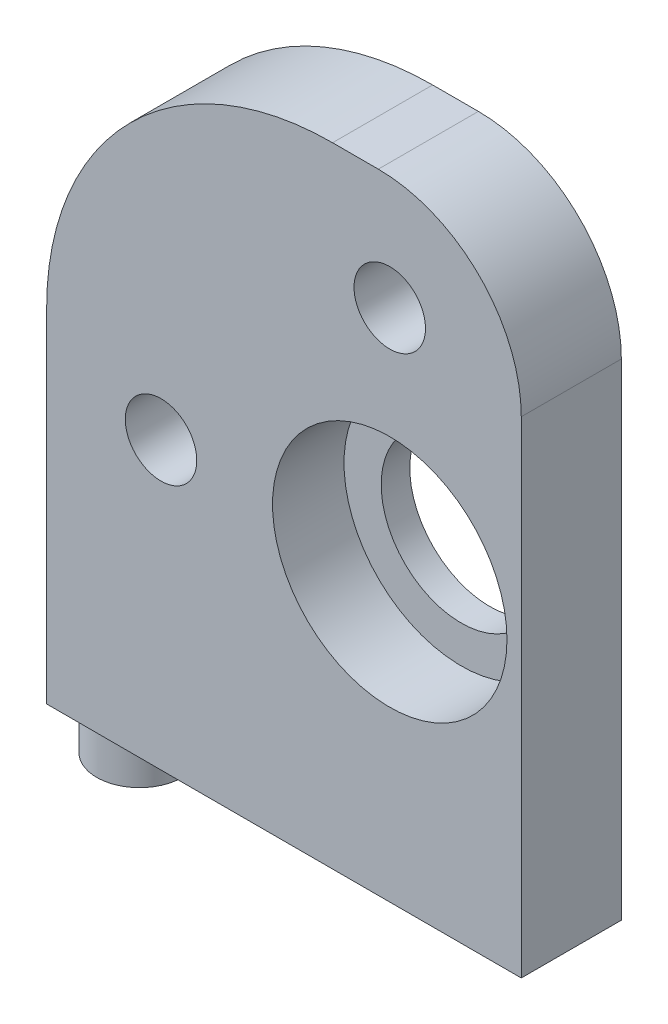
ISO-10303-21;
HEADER;
FILE_DESCRIPTION(('STEP AP214'),'2;1');
FILE_NAME('part.step','',(''),(''),'','','');
FILE_SCHEMA(('AUTOMOTIVE_DESIGN { 1 0 10303 214 1 1 1 1 }'));
ENDSEC;
DATA;
#1=APPLICATION_CONTEXT('core data for automotive mechanical design processes');
#2=APPLICATION_PROTOCOL_DEFINITION('international standard','automotive_design',2000,#1);
#3=PRODUCT_CONTEXT('',#1,'mechanical');
#4=PRODUCT('Part','Part','',(#3));
#5=PRODUCT_RELATED_PRODUCT_CATEGORY('part','',(#4));
#6=PRODUCT_DEFINITION_FORMATION('','',#4);
#7=PRODUCT_DEFINITION_CONTEXT('part definition',#1,'design');
#8=PRODUCT_DEFINITION('design','',#6,#7);
#9=PRODUCT_DEFINITION_SHAPE('','',#8);
#10=(LENGTH_UNIT() NAMED_UNIT(*) SI_UNIT(.MILLI.,.METRE.));
#11=(NAMED_UNIT(*) PLANE_ANGLE_UNIT() SI_UNIT($,.RADIAN.));
#12=(NAMED_UNIT(*) SI_UNIT($,.STERADIAN.) SOLID_ANGLE_UNIT());
#13=UNCERTAINTY_MEASURE_WITH_UNIT(LENGTH_MEASURE(1.E-05),#10,'distance_accuracy_value','');
#14=(GEOMETRIC_REPRESENTATION_CONTEXT(3) GLOBAL_UNCERTAINTY_ASSIGNED_CONTEXT((#13)) GLOBAL_UNIT_ASSIGNED_CONTEXT((#10,
#11,#12)) REPRESENTATION_CONTEXT('',''));
#15=CARTESIAN_POINT('',(0.,0.,0.));
#16=DIRECTION('',(0.,0.,1.));
#17=DIRECTION('',(1.,0.,0.));
#18=AXIS2_PLACEMENT_3D('',#15,#16,#17);
#19=CARTESIAN_POINT('',(4.6,0.,3.5));
#20=DIRECTION('',(1.,0.,0.));
#21=DIRECTION('',(0.,1.,0.));
#22=AXIS2_PLACEMENT_3D('',#19,#20,#21);
#23=PLANE('',#22);
#24=DIRECTION('',(0.,-1.,0.));
#25=VECTOR('',#24,1.);
#26=CARTESIAN_POINT('',(4.6,0.,0.));
#27=LINE('',#26,#25);
#28=CARTESIAN_POINT('',(4.6,7.,0.));
#29=VERTEX_POINT('',#28);
#30=CARTESIAN_POINT('',(4.6,-10.,0.));
#31=VERTEX_POINT('',#30);
#32=EDGE_CURVE('E164',#29,#31,#27,.T.);
#33=ORIENTED_EDGE('',*,*,#32,.F.);
#34=DIRECTION('',(0.,0.,-1.));
#35=VECTOR('',#34,1.);
#36=CARTESIAN_POINT('',(4.6,7.,3.5));
#37=LINE('',#36,#35);
#38=CARTESIAN_POINT('',(4.6,7.,3.5));
#39=VERTEX_POINT('',#38);
#40=EDGE_CURVE('E54',#29,#39,#37,.F.);
#41=ORIENTED_EDGE('',*,*,#40,.T.);
#42=DIRECTION('',(0.,-1.,0.));
#43=VECTOR('',#42,1.);
#44=CARTESIAN_POINT('',(4.6,0.,3.5));
#45=LINE('',#44,#43);
#46=CARTESIAN_POINT('',(4.6,-10.,3.5));
#47=VERTEX_POINT('',#46);
#48=EDGE_CURVE('E192',#39,#47,#45,.T.);
#49=ORIENTED_EDGE('',*,*,#48,.T.);
#50=DIRECTION('',(0.,0.,-1.));
#51=VECTOR('',#50,1.);
#52=CARTESIAN_POINT('',(4.6,-10.,3.5));
#53=LINE('',#52,#51);
#54=EDGE_CURVE('E123',#47,#31,#53,.T.);
#55=ORIENTED_EDGE('',*,*,#54,.T.);
#56=EDGE_LOOP('',(#33,#41,#49,#55));
#57=FACE_BOUND('',#56,.T.);
#58=ADVANCED_FACE('F45',(#57),#23,.T.);
#59=CARTESIAN_POINT('',(0.,12.,3.5));
#60=DIRECTION('',(0.,1.,0.));
#61=DIRECTION('',(0.,0.,1.));
#62=AXIS2_PLACEMENT_3D('',#59,#60,#61);
#63=PLANE('',#62);
#64=DIRECTION('',(1.,0.,0.));
#65=VECTOR('',#64,1.);
#66=CARTESIAN_POINT('',(0.,12.,3.5));
#67=LINE('',#66,#65);
#68=CARTESIAN_POINT('',(-2.,12.,3.5));
#69=VERTEX_POINT('',#68);
#70=CARTESIAN_POINT('',(-0.400000000000001,12.,3.5));
#71=VERTEX_POINT('',#70);
#72=EDGE_CURVE('E158',#69,#71,#67,.T.);
#73=ORIENTED_EDGE('',*,*,#72,.T.);
#74=DIRECTION('',(0.,0.,-1.));
#75=VECTOR('',#74,1.);
#76=CARTESIAN_POINT('',(-0.400000000000001,12.,3.5));
#77=LINE('',#76,#75);
#78=CARTESIAN_POINT('',(-0.400000000000001,12.,0.));
#79=VERTEX_POINT('',#78);
#80=EDGE_CURVE('E144',#71,#79,#77,.T.);
#81=ORIENTED_EDGE('',*,*,#80,.T.);
#82=DIRECTION('',(1.,0.,0.));
#83=VECTOR('',#82,1.);
#84=CARTESIAN_POINT('',(0.,12.,0.));
#85=LINE('',#84,#83);
#86=CARTESIAN_POINT('',(-2.,12.,0.));
#87=VERTEX_POINT('',#86);
#88=EDGE_CURVE('E155',#87,#79,#85,.T.);
#89=ORIENTED_EDGE('',*,*,#88,.F.);
#90=DIRECTION('',(0.,0.,-1.));
#91=VECTOR('',#90,1.);
#92=CARTESIAN_POINT('',(-2.,12.,3.5));
#93=LINE('',#92,#91);
#94=EDGE_CURVE('E138',#87,#69,#93,.F.);
#95=ORIENTED_EDGE('',*,*,#94,.T.);
#96=EDGE_LOOP('',(#73,#81,#89,#95));
#97=FACE_BOUND('',#96,.T.);
#98=ADVANCED_FACE('F154',(#97),#63,.T.);
#99=CARTESIAN_POINT('',(-12.,0.,3.5));
#100=DIRECTION('',(1.,0.,0.));
#101=DIRECTION('',(0.,1.,0.));
#102=AXIS2_PLACEMENT_3D('',#99,#100,#101);
#103=PLANE('',#102);
#104=DIRECTION('',(0.,-1.,0.));
#105=VECTOR('',#104,1.);
#106=CARTESIAN_POINT('',(-12.,0.,3.5));
#107=LINE('',#106,#105);
#108=CARTESIAN_POINT('',(-12.,2.,3.5));
#109=VERTEX_POINT('',#108);
#110=CARTESIAN_POINT('',(-12.,-10.,3.5));
#111=VERTEX_POINT('',#110);
#112=EDGE_CURVE('E197',#109,#111,#107,.T.);
#113=ORIENTED_EDGE('',*,*,#112,.F.);
#114=DIRECTION('',(0.,0.,-1.));
#115=VECTOR('',#114,1.);
#116=CARTESIAN_POINT('',(-12.,2.,0.));
#117=LINE('',#116,#115);
#118=CARTESIAN_POINT('',(-12.,2.,0.));
#119=VERTEX_POINT('',#118);
#120=EDGE_CURVE('E132',#109,#119,#117,.T.);
#121=ORIENTED_EDGE('',*,*,#120,.T.);
#122=DIRECTION('',(0.,-1.,0.));
#123=VECTOR('',#122,1.);
#124=CARTESIAN_POINT('',(-12.,0.,0.));
#125=LINE('',#124,#123);
#126=CARTESIAN_POINT('',(-12.,-10.,0.));
#127=VERTEX_POINT('',#126);
#128=EDGE_CURVE('E119',#119,#127,#125,.T.);
#129=ORIENTED_EDGE('',*,*,#128,.T.);
#130=DIRECTION('',(0.,0.,-1.));
#131=VECTOR('',#130,1.);
#132=CARTESIAN_POINT('',(-12.,-10.,3.5));
#133=LINE('',#132,#131);
#134=CARTESIAN_POINT('',(-12.,-10.,1.75));
#135=VERTEX_POINT('',#134);
#136=EDGE_CURVE('E113',#135,#127,#133,.T.);
#137=ORIENTED_EDGE('',*,*,#136,.F.);
#138=EDGE_CURVE('E101',#111,#135,#133,.T.);
#139=ORIENTED_EDGE('',*,*,#138,.F.);
#140=EDGE_LOOP('',(#113,#121,#129,#137,#139));
#141=FACE_BOUND('',#140,.T.);
#142=ADVANCED_FACE('F116',(#141),#103,.F.);
#143=CARTESIAN_POINT('',(0.,0.,3.5));
#144=DIRECTION('',(0.,0.,-1.));
#145=DIRECTION('',(-1.,0.,0.));
#146=AXIS2_PLACEMENT_3D('',#143,#144,#145);
#147=CYLINDRICAL_SURFACE('',#146,4.1);
#148=CARTESIAN_POINT('',(0.,0.,1.));
#149=DIRECTION('',(0.,0.,1.));
#150=DIRECTION('',(1.,0.,0.));
#151=AXIS2_PLACEMENT_3D('',#148,#149,#150);
#152=CIRCLE('',#151,4.1);
#153=CARTESIAN_POINT('',(4.1,0.,1.));
#154=VERTEX_POINT('',#153);
#155=EDGE_CURVE('E112',#154,#154,#152,.T.);
#156=ORIENTED_EDGE('',*,*,#155,.F.);
#157=EDGE_LOOP('',(#156));
#158=FACE_BOUND('',#157,.T.);
#159=CARTESIAN_POINT('',(0.,0.,3.5));
#160=DIRECTION('',(0.,0.,1.));
#161=DIRECTION('',(1.,0.,0.));
#162=AXIS2_PLACEMENT_3D('',#159,#160,#161);
#163=CIRCLE('',#162,4.1);
#164=CARTESIAN_POINT('',(4.1,0.,3.5));
#165=VERTEX_POINT('',#164);
#166=EDGE_CURVE('E183',#165,#165,#163,.T.);
#167=ORIENTED_EDGE('',*,*,#166,.T.);
#168=EDGE_LOOP('',(#167));
#169=FACE_BOUND('',#168,.T.);
#170=ADVANCED_FACE('F214',(#158,#169),#147,.F.);
#171=CARTESIAN_POINT('',(0.,8.,3.5));
#172=DIRECTION('',(0.,0.,-1.));
#173=DIRECTION('',(-1.,0.,0.));
#174=AXIS2_PLACEMENT_3D('',#171,#172,#173);
#175=CYLINDRICAL_SURFACE('',#174,1.25);
#176=CARTESIAN_POINT('',(0.,8.,3.5));
#177=DIRECTION('',(0.,0.,1.));
#178=DIRECTION('',(1.,0.,0.));
#179=AXIS2_PLACEMENT_3D('',#176,#177,#178);
#180=CIRCLE('',#179,1.25);
#181=CARTESIAN_POINT('',(1.25,8.,3.5));
#182=VERTEX_POINT('',#181);
#183=EDGE_CURVE('E177',#182,#182,#180,.T.);
#184=ORIENTED_EDGE('',*,*,#183,.T.);
#185=EDGE_LOOP('',(#184));
#186=FACE_BOUND('',#185,.T.);
#187=CARTESIAN_POINT('',(0.,8.,0.));
#188=DIRECTION('',(0.,0.,1.));
#189=DIRECTION('',(1.,0.,0.));
#190=AXIS2_PLACEMENT_3D('',#187,#188,#189);
#191=CIRCLE('',#190,1.25);
#192=CARTESIAN_POINT('',(1.25,8.,0.));
#193=VERTEX_POINT('',#192);
#194=EDGE_CURVE('E170',#193,#193,#191,.T.);
#195=ORIENTED_EDGE('',*,*,#194,.F.);
#196=EDGE_LOOP('',(#195));
#197=FACE_BOUND('',#196,.T.);
#198=ADVANCED_FACE('F211',(#186,#197),#175,.F.);
#199=CARTESIAN_POINT('',(-8.,0.,3.5));
#200=DIRECTION('',(0.,0.,-1.));
#201=DIRECTION('',(-1.,0.,0.));
#202=AXIS2_PLACEMENT_3D('',#199,#200,#201);
#203=CYLINDRICAL_SURFACE('',#202,1.25);
#204=CARTESIAN_POINT('',(-8.,0.,3.5));
#205=DIRECTION('',(0.,0.,1.));
#206=DIRECTION('',(1.,0.,0.));
#207=AXIS2_PLACEMENT_3D('',#204,#205,#206);
#208=CIRCLE('',#207,1.25);
#209=CARTESIAN_POINT('',(-6.75,0.,3.5));
#210=VERTEX_POINT('',#209);
#211=EDGE_CURVE('E174',#210,#210,#208,.T.);
#212=ORIENTED_EDGE('',*,*,#211,.T.);
#213=EDGE_LOOP('',(#212));
#214=FACE_BOUND('',#213,.T.);
#215=CARTESIAN_POINT('',(-8.,0.,0.));
#216=DIRECTION('',(0.,0.,1.));
#217=DIRECTION('',(1.,0.,0.));
#218=AXIS2_PLACEMENT_3D('',#215,#216,#217);
#219=CIRCLE('',#218,1.25);
#220=CARTESIAN_POINT('',(-6.75,0.,0.));
#221=VERTEX_POINT('',#220);
#222=EDGE_CURVE('E202',#221,#221,#219,.T.);
#223=ORIENTED_EDGE('',*,*,#222,.F.);
#224=EDGE_LOOP('',(#223));
#225=FACE_BOUND('',#224,.T.);
#226=ADVANCED_FACE('F213',(#214,#225),#203,.F.);
#227=CARTESIAN_POINT('',(0.,-10.,3.5));
#228=DIRECTION('',(0.,1.,0.));
#229=DIRECTION('',(0.,0.,1.));
#230=AXIS2_PLACEMENT_3D('',#227,#228,#229);
#231=PLANE('',#230);
#232=CARTESIAN_POINT('',(-4.5,-10.,1.75));
#233=DIRECTION('',(0.,-1.,0.));
#234=DIRECTION('',(0.,0.,-1.));
#235=AXIS2_PLACEMENT_3D('',#232,#233,#234);
#236=CIRCLE('',#235,1.);
#237=CARTESIAN_POINT('',(-4.5,-10.,0.75));
#238=VERTEX_POINT('',#237);
#239=EDGE_CURVE('E273',#238,#238,#236,.T.);
#240=ORIENTED_EDGE('',*,*,#239,.F.);
#241=EDGE_LOOP('',(#240));
#242=FACE_BOUND('',#241,.T.);
#243=ORIENTED_EDGE('',*,*,#138,.T.);
#244=CARTESIAN_POINT('',(-10.5,-10.,1.75));
#245=DIRECTION('',(0.,-1.,0.));
#246=DIRECTION('',(0.,0.,-1.));
#247=AXIS2_PLACEMENT_3D('',#244,#245,#246);
#248=CIRCLE('',#247,1.5);
#249=EDGE_CURVE('E105',#135,#135,#248,.T.);
#250=ORIENTED_EDGE('',*,*,#249,.F.);
#251=ORIENTED_EDGE('',*,*,#136,.T.);
#252=DIRECTION('',(1.,0.,0.));
#253=VECTOR('',#252,1.);
#254=CARTESIAN_POINT('',(0.,-10.,0.));
#255=LINE('',#254,#253);
#256=EDGE_CURVE('E168',#127,#31,#255,.T.);
#257=ORIENTED_EDGE('',*,*,#256,.T.);
#258=ORIENTED_EDGE('',*,*,#54,.F.);
#259=DIRECTION('',(1.,0.,0.));
#260=VECTOR('',#259,1.);
#261=CARTESIAN_POINT('',(0.,-10.,3.5));
#262=LINE('',#261,#260);
#263=EDGE_CURVE('E108',#111,#47,#262,.T.);
#264=ORIENTED_EDGE('',*,*,#263,.F.);
#265=EDGE_LOOP('',(#243,#250,#251,#257,#258,#264));
#266=FACE_BOUND('',#265,.T.);
#267=ADVANCED_FACE('F103',(#242,#266),#231,.F.);
#268=CARTESIAN_POINT('',(0.,0.,3.5));
#269=DIRECTION('',(0.,0.,1.));
#270=DIRECTION('',(1.,0.,0.));
#271=AXIS2_PLACEMENT_3D('',#268,#269,#270);
#272=PLANE('',#271);
#273=ORIENTED_EDGE('',*,*,#211,.F.);
#274=EDGE_LOOP('',(#273));
#275=FACE_BOUND('',#274,.T.);
#276=ORIENTED_EDGE('',*,*,#183,.F.);
#277=EDGE_LOOP('',(#276));
#278=FACE_BOUND('',#277,.T.);
#279=ORIENTED_EDGE('',*,*,#166,.F.);
#280=EDGE_LOOP('',(#279));
#281=FACE_BOUND('',#280,.T.);
#282=ORIENTED_EDGE('',*,*,#48,.F.);
#283=CARTESIAN_POINT('',(-0.400000000000001,7.,3.5));
#284=DIRECTION('',(0.,0.,1.));
#285=DIRECTION('',(1.,0.,0.));
#286=AXIS2_PLACEMENT_3D('',#283,#284,#285);
#287=CIRCLE('',#286,5.);
#288=EDGE_CURVE('E11',#39,#71,#287,.T.);
#289=ORIENTED_EDGE('',*,*,#288,.T.);
#290=ORIENTED_EDGE('',*,*,#72,.F.);
#291=CARTESIAN_POINT('',(-2.,2.,3.5));
#292=DIRECTION('',(0.,0.,1.));
#293=DIRECTION('',(1.,0.,0.));
#294=AXIS2_PLACEMENT_3D('',#291,#292,#293);
#295=CIRCLE('',#294,10.);
#296=EDGE_CURVE('E141',#69,#109,#295,.T.);
#297=ORIENTED_EDGE('',*,*,#296,.T.);
#298=ORIENTED_EDGE('',*,*,#112,.T.);
#299=ORIENTED_EDGE('',*,*,#263,.T.);
#300=EDGE_LOOP('',(#282,#289,#290,#297,#298,#299));
#301=FACE_BOUND('',#300,.T.);
#302=ADVANCED_FACE('F235',(#275,#278,#281,#301),#272,.T.);
#303=CARTESIAN_POINT('',(0.,0.,0.));
#304=DIRECTION('',(0.,0.,1.));
#305=DIRECTION('',(1.,0.,0.));
#306=AXIS2_PLACEMENT_3D('',#303,#304,#305);
#307=PLANE('',#306);
#308=ORIENTED_EDGE('',*,*,#222,.T.);
#309=EDGE_LOOP('',(#308));
#310=FACE_BOUND('',#309,.T.);
#311=ORIENTED_EDGE('',*,*,#194,.T.);
#312=EDGE_LOOP('',(#311));
#313=FACE_BOUND('',#312,.T.);
#314=ORIENTED_EDGE('',*,*,#88,.T.);
#315=CARTESIAN_POINT('',(-0.400000000000001,7.,0.));
#316=DIRECTION('',(0.,0.,1.));
#317=DIRECTION('',(1.,0.,0.));
#318=AXIS2_PLACEMENT_3D('',#315,#316,#317);
#319=CIRCLE('',#318,5.);
#320=EDGE_CURVE('E68',#79,#29,#319,.F.);
#321=ORIENTED_EDGE('',*,*,#320,.T.);
#322=ORIENTED_EDGE('',*,*,#32,.T.);
#323=ORIENTED_EDGE('',*,*,#256,.F.);
#324=ORIENTED_EDGE('',*,*,#128,.F.);
#325=CARTESIAN_POINT('',(-2.,2.,0.));
#326=DIRECTION('',(0.,0.,1.));
#327=DIRECTION('',(1.,0.,0.));
#328=AXIS2_PLACEMENT_3D('',#325,#326,#327);
#329=CIRCLE('',#328,10.);
#330=EDGE_CURVE('E135',#119,#87,#329,.F.);
#331=ORIENTED_EDGE('',*,*,#330,.T.);
#332=EDGE_LOOP('',(#314,#321,#322,#323,#324,#331));
#333=FACE_BOUND('',#332,.T.);
#334=CARTESIAN_POINT('',(0.,0.,0.));
#335=DIRECTION('',(0.,0.,1.));
#336=DIRECTION('',(1.,0.,0.));
#337=AXIS2_PLACEMENT_3D('',#334,#335,#336);
#338=CIRCLE('',#337,2.8);
#339=CARTESIAN_POINT('',(2.8,0.,0.));
#340=VERTEX_POINT('',#339);
#341=EDGE_CURVE('E186',#340,#340,#338,.T.);
#342=ORIENTED_EDGE('',*,*,#341,.T.);
#343=EDGE_LOOP('',(#342));
#344=FACE_BOUND('',#343,.T.);
#345=ADVANCED_FACE('F161',(#310,#313,#333,#344),#307,.F.);
#346=CARTESIAN_POINT('',(0.,0.,1.));
#347=DIRECTION('',(0.,0.,-1.));
#348=DIRECTION('',(-1.,0.,0.));
#349=AXIS2_PLACEMENT_3D('',#346,#347,#348);
#350=CYLINDRICAL_SURFACE('',#349,2.8);
#351=CARTESIAN_POINT('',(0.,0.,1.));
#352=DIRECTION('',(0.,0.,1.));
#353=DIRECTION('',(1.,0.,0.));
#354=AXIS2_PLACEMENT_3D('',#351,#352,#353);
#355=CIRCLE('',#354,2.8);
#356=CARTESIAN_POINT('',(2.8,0.,1.));
#357=VERTEX_POINT('',#356);
#358=EDGE_CURVE('E205',#357,#357,#355,.T.);
#359=ORIENTED_EDGE('',*,*,#358,.T.);
#360=EDGE_LOOP('',(#359));
#361=FACE_BOUND('',#360,.T.);
#362=ORIENTED_EDGE('',*,*,#341,.F.);
#363=EDGE_LOOP('',(#362));
#364=FACE_BOUND('',#363,.T.);
#365=ADVANCED_FACE('F239',(#361,#364),#350,.F.);
#366=CARTESIAN_POINT('',(0.,0.,1.));
#367=DIRECTION('',(0.,0.,1.));
#368=DIRECTION('',(1.,0.,0.));
#369=AXIS2_PLACEMENT_3D('',#366,#367,#368);
#370=PLANE('',#369);
#371=ORIENTED_EDGE('',*,*,#358,.F.);
#372=EDGE_LOOP('',(#371));
#373=FACE_BOUND('',#372,.T.);
#374=ORIENTED_EDGE('',*,*,#155,.T.);
#375=EDGE_LOOP('',(#374));
#376=FACE_BOUND('',#375,.T.);
#377=ADVANCED_FACE('F246',(#373,#376),#370,.T.);
#378=CARTESIAN_POINT('',(-2.,2.,3.5));
#379=DIRECTION('',(0.,0.,1.));
#380=DIRECTION('',(1.,0.,0.));
#381=AXIS2_PLACEMENT_3D('',#378,#379,#380);
#382=CYLINDRICAL_SURFACE('',#381,10.);
#383=ORIENTED_EDGE('',*,*,#296,.F.);
#384=ORIENTED_EDGE('',*,*,#94,.F.);
#385=ORIENTED_EDGE('',*,*,#330,.F.);
#386=ORIENTED_EDGE('',*,*,#120,.F.);
#387=EDGE_LOOP('',(#383,#384,#385,#386));
#388=FACE_BOUND('',#387,.T.);
#389=ADVANCED_FACE('F250',(#388),#382,.T.);
#390=CARTESIAN_POINT('',(-0.400000000000001,7.,3.5));
#391=DIRECTION('',(0.,0.,-1.));
#392=DIRECTION('',(-1.,0.,0.));
#393=AXIS2_PLACEMENT_3D('',#390,#391,#392);
#394=CYLINDRICAL_SURFACE('',#393,5.);
#395=ORIENTED_EDGE('',*,*,#288,.F.);
#396=ORIENTED_EDGE('',*,*,#40,.F.);
#397=ORIENTED_EDGE('',*,*,#320,.F.);
#398=ORIENTED_EDGE('',*,*,#80,.F.);
#399=EDGE_LOOP('',(#395,#396,#397,#398));
#400=FACE_BOUND('',#399,.T.);
#401=ADVANCED_FACE('F47',(#400),#394,.T.);
#402=CARTESIAN_POINT('',(-4.5,-4.,1.75));
#403=DIRECTION('',(0.,-1.,0.));
#404=DIRECTION('',(0.,0.,-1.));
#405=AXIS2_PLACEMENT_3D('',#402,#403,#404);
#406=CYLINDRICAL_SURFACE('',#405,1.);
#407=CARTESIAN_POINT('',(-4.5,-4.,1.75));
#408=DIRECTION('',(0.,-1.,0.));
#409=DIRECTION('',(0.,0.,-1.));
#410=AXIS2_PLACEMENT_3D('',#407,#408,#409);
#411=CIRCLE('',#410,1.);
#412=CARTESIAN_POINT('',(-4.5,-4.,0.75));
#413=VERTEX_POINT('',#412);
#414=EDGE_CURVE('E278',#413,#413,#411,.T.);
#415=ORIENTED_EDGE('',*,*,#414,.F.);
#416=EDGE_LOOP('',(#415));
#417=FACE_BOUND('',#416,.T.);
#418=ORIENTED_EDGE('',*,*,#239,.T.);
#419=EDGE_LOOP('',(#418));
#420=FACE_BOUND('',#419,.T.);
#421=ADVANCED_FACE('F252',(#417,#420),#406,.F.);
#422=CARTESIAN_POINT('',(0.,-4.,0.));
#423=DIRECTION('',(0.,-1.,0.));
#424=DIRECTION('',(0.,0.,-1.));
#425=AXIS2_PLACEMENT_3D('',#422,#423,#424);
#426=PLANE('',#425);
#427=ORIENTED_EDGE('',*,*,#414,.T.);
#428=EDGE_LOOP('',(#427));
#429=FACE_BOUND('',#428,.T.);
#430=ADVANCED_FACE('F255',(#429),#426,.T.);
#431=CARTESIAN_POINT('',(-10.5,-11.6,1.75));
#432=DIRECTION('',(0.,1.,0.));
#433=DIRECTION('',(0.,0.,1.));
#434=AXIS2_PLACEMENT_3D('',#431,#432,#433);
#435=CYLINDRICAL_SURFACE('',#434,1.5);
#436=CARTESIAN_POINT('',(-10.5,-11.6,1.75));
#437=DIRECTION('',(0.,-1.,0.));
#438=DIRECTION('',(0.,0.,-1.));
#439=AXIS2_PLACEMENT_3D('',#436,#437,#438);
#440=CIRCLE('',#439,1.5);
#441=CARTESIAN_POINT('',(-10.5,-11.6,0.249999999999999));
#442=VERTEX_POINT('',#441);
#443=EDGE_CURVE('E271',#442,#442,#440,.T.);
#444=ORIENTED_EDGE('',*,*,#443,.F.);
#445=EDGE_LOOP('',(#444));
#446=FACE_BOUND('',#445,.T.);
#447=ORIENTED_EDGE('',*,*,#249,.T.);
#448=EDGE_LOOP('',(#447));
#449=FACE_BOUND('',#448,.T.);
#450=ADVANCED_FACE('F259',(#446,#449),#435,.T.);
#451=CARTESIAN_POINT('',(0.,-11.6,0.));
#452=DIRECTION('',(0.,-1.,0.));
#453=DIRECTION('',(0.,0.,-1.));
#454=AXIS2_PLACEMENT_3D('',#451,#452,#453);
#455=PLANE('',#454);
#456=ORIENTED_EDGE('',*,*,#443,.T.);
#457=EDGE_LOOP('',(#456));
#458=FACE_BOUND('',#457,.T.);
#459=ADVANCED_FACE('F263',(#458),#455,.T.);
#460=CLOSED_SHELL('',(#58,#98,#142,#170,#198,#226,#267,#302,#345,#365,#377,#389,#401,#421,#430,
#450,#459));
#461=MANIFOLD_SOLID_BREP('B2',#460);
#462=ADVANCED_BREP_SHAPE_REPRESENTATION('',(#18,#461),#14);
#463=SHAPE_DEFINITION_REPRESENTATION(#9,#462);
ENDSEC;
END-ISO-10303-21;
